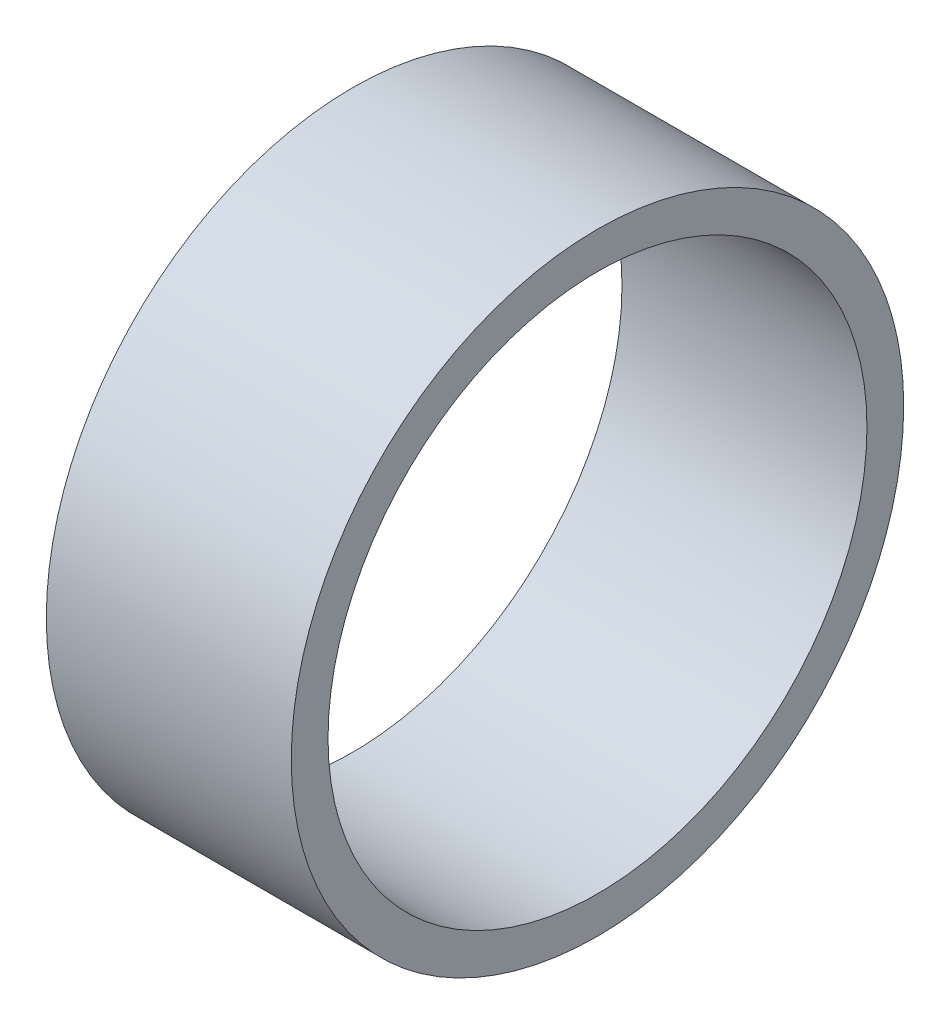
ISO-10303-21;
HEADER;
FILE_DESCRIPTION(('STEP AP214'),'2;1');
FILE_NAME('part.step','',(''),(''),'','','');
FILE_SCHEMA(('AUTOMOTIVE_DESIGN { 1 0 10303 214 1 1 1 1 }'));
ENDSEC;
DATA;
#1=APPLICATION_CONTEXT('core data for automotive mechanical design processes');
#2=APPLICATION_PROTOCOL_DEFINITION('international standard','automotive_design',2000,#1);
#3=PRODUCT_CONTEXT('',#1,'mechanical');
#4=PRODUCT('Part','Part','',(#3));
#5=PRODUCT_RELATED_PRODUCT_CATEGORY('part','',(#4));
#6=PRODUCT_DEFINITION_FORMATION('','',#4);
#7=PRODUCT_DEFINITION_CONTEXT('part definition',#1,'design');
#8=PRODUCT_DEFINITION('design','',#6,#7);
#9=PRODUCT_DEFINITION_SHAPE('','',#8);
#10=(LENGTH_UNIT() NAMED_UNIT(*) SI_UNIT(.MILLI.,.METRE.));
#11=(NAMED_UNIT(*) PLANE_ANGLE_UNIT() SI_UNIT($,.RADIAN.));
#12=(NAMED_UNIT(*) SI_UNIT($,.STERADIAN.) SOLID_ANGLE_UNIT());
#13=UNCERTAINTY_MEASURE_WITH_UNIT(LENGTH_MEASURE(1.E-05),#10,'distance_accuracy_value','');
#14=(GEOMETRIC_REPRESENTATION_CONTEXT(3) GLOBAL_UNCERTAINTY_ASSIGNED_CONTEXT((#13)) GLOBAL_UNIT_ASSIGNED_CONTEXT((#10,
#11,#12)) REPRESENTATION_CONTEXT('',''));
#15=CARTESIAN_POINT('',(0.,0.,0.));
#16=DIRECTION('',(0.,0.,1.));
#17=DIRECTION('',(1.,0.,0.));
#18=AXIS2_PLACEMENT_3D('',#15,#16,#17);
#19=CARTESIAN_POINT('',(-45.4223968565815,0.,0.));
#20=DIRECTION('',(-1.,0.,0.));
#21=DIRECTION('',(0.,0.,1.));
#22=AXIS2_PLACEMENT_3D('',#19,#20,#21);
#23=CYLINDRICAL_SURFACE('',#22,50.);
#24=CARTESIAN_POINT('',(-20.,0.,0.));
#25=DIRECTION('',(-1.,0.,0.));
#26=DIRECTION('',(0.,0.,1.));
#27=AXIS2_PLACEMENT_3D('',#24,#25,#26);
#28=CIRCLE('',#27,50.);
#29=CARTESIAN_POINT('',(-20.,0.,50.));
#30=VERTEX_POINT('',#29);
#31=EDGE_CURVE('E10',#30,#30,#28,.T.);
#32=ORIENTED_EDGE('',*,*,#31,.F.);
#33=EDGE_LOOP('',(#32));
#34=FACE_BOUND('',#33,.T.);
#35=CARTESIAN_POINT('',(20.,0.,0.));
#36=DIRECTION('',(-1.,0.,0.));
#37=DIRECTION('',(0.,0.,1.));
#38=AXIS2_PLACEMENT_3D('',#35,#36,#37);
#39=CIRCLE('',#38,50.);
#40=CARTESIAN_POINT('',(20.,0.,50.));
#41=VERTEX_POINT('',#40);
#42=EDGE_CURVE('E54',#41,#41,#39,.T.);
#43=ORIENTED_EDGE('',*,*,#42,.T.);
#44=EDGE_LOOP('',(#43));
#45=FACE_BOUND('',#44,.T.);
#46=ADVANCED_FACE('F37',(#34,#45),#23,.T.);
#47=CARTESIAN_POINT('',(-20.,50.,0.));
#48=DIRECTION('',(1.,0.,0.));
#49=DIRECTION('',(0.,0.,-1.));
#50=AXIS2_PLACEMENT_3D('',#47,#48,#49);
#51=PLANE('',#50);
#52=CARTESIAN_POINT('',(-20.,0.,0.));
#53=DIRECTION('',(-1.,0.,0.));
#54=DIRECTION('',(0.,0.,1.));
#55=AXIS2_PLACEMENT_3D('',#52,#53,#54);
#56=CIRCLE('',#55,44.);
#57=CARTESIAN_POINT('',(-20.,0.,44.));
#58=VERTEX_POINT('',#57);
#59=EDGE_CURVE('E44',#58,#58,#56,.T.);
#60=ORIENTED_EDGE('',*,*,#59,.F.);
#61=EDGE_LOOP('',(#60));
#62=FACE_BOUND('',#61,.T.);
#63=ORIENTED_EDGE('',*,*,#31,.T.);
#64=EDGE_LOOP('',(#63));
#65=FACE_BOUND('',#64,.T.);
#66=ADVANCED_FACE('F70',(#62,#65),#51,.F.);
#67=CARTESIAN_POINT('',(-45.4223968565815,0.,0.));
#68=DIRECTION('',(-1.,0.,0.));
#69=DIRECTION('',(0.,0.,1.));
#70=AXIS2_PLACEMENT_3D('',#67,#68,#69);
#71=CYLINDRICAL_SURFACE('',#70,44.);
#72=CARTESIAN_POINT('',(20.,0.,0.));
#73=DIRECTION('',(-1.,0.,0.));
#74=DIRECTION('',(0.,0.,1.));
#75=AXIS2_PLACEMENT_3D('',#72,#73,#74);
#76=CIRCLE('',#75,44.);
#77=CARTESIAN_POINT('',(20.,0.,44.));
#78=VERTEX_POINT('',#77);
#79=EDGE_CURVE('E49',#78,#78,#76,.T.);
#80=ORIENTED_EDGE('',*,*,#79,.F.);
#81=EDGE_LOOP('',(#80));
#82=FACE_BOUND('',#81,.T.);
#83=ORIENTED_EDGE('',*,*,#59,.T.);
#84=EDGE_LOOP('',(#83));
#85=FACE_BOUND('',#84,.T.);
#86=ADVANCED_FACE('F65',(#82,#85),#71,.F.);
#87=CARTESIAN_POINT('',(20.,44.,0.));
#88=DIRECTION('',(-1.,0.,0.));
#89=DIRECTION('',(0.,0.,1.));
#90=AXIS2_PLACEMENT_3D('',#87,#88,#89);
#91=PLANE('',#90);
#92=ORIENTED_EDGE('',*,*,#42,.F.);
#93=EDGE_LOOP('',(#92));
#94=FACE_BOUND('',#93,.T.);
#95=ORIENTED_EDGE('',*,*,#79,.T.);
#96=EDGE_LOOP('',(#95));
#97=FACE_BOUND('',#96,.T.);
#98=ADVANCED_FACE('F62',(#94,#97),#91,.F.);
#99=CLOSED_SHELL('',(#46,#66,#86,#98));
#100=MANIFOLD_SOLID_BREP('B2',#99);
#101=ADVANCED_BREP_SHAPE_REPRESENTATION('',(#18,#100),#14);
#102=SHAPE_DEFINITION_REPRESENTATION(#9,#101);
ENDSEC;
END-ISO-10303-21;
